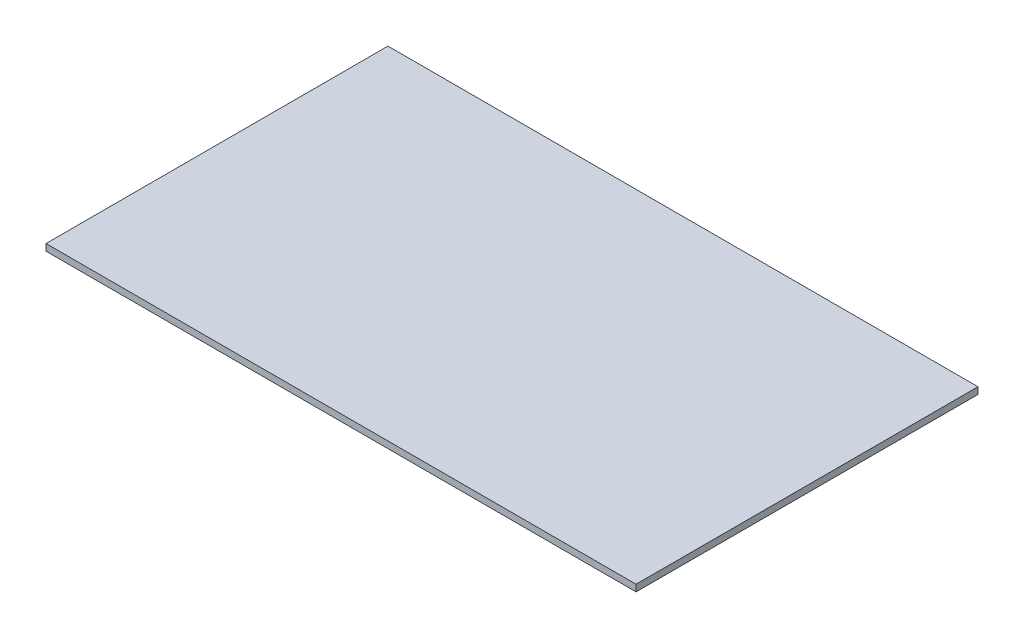
ISO-10303-21;
HEADER;
FILE_DESCRIPTION(('STEP AP214'),'2;1');
FILE_NAME('part.step','',(''),(''),'','','');
FILE_SCHEMA(('AUTOMOTIVE_DESIGN { 1 0 10303 214 1 1 1 1 }'));
ENDSEC;
DATA;
#1=APPLICATION_CONTEXT('core data for automotive mechanical design processes');
#2=APPLICATION_PROTOCOL_DEFINITION('international standard','automotive_design',2000,#1);
#3=PRODUCT_CONTEXT('',#1,'mechanical');
#4=PRODUCT('Part','Part','',(#3));
#5=PRODUCT_RELATED_PRODUCT_CATEGORY('part','',(#4));
#6=PRODUCT_DEFINITION_FORMATION('','',#4);
#7=PRODUCT_DEFINITION_CONTEXT('part definition',#1,'design');
#8=PRODUCT_DEFINITION('design','',#6,#7);
#9=PRODUCT_DEFINITION_SHAPE('','',#8);
#10=(LENGTH_UNIT() NAMED_UNIT(*) SI_UNIT(.MILLI.,.METRE.));
#11=(NAMED_UNIT(*) PLANE_ANGLE_UNIT() SI_UNIT($,.RADIAN.));
#12=(NAMED_UNIT(*) SI_UNIT($,.STERADIAN.) SOLID_ANGLE_UNIT());
#13=UNCERTAINTY_MEASURE_WITH_UNIT(LENGTH_MEASURE(1.E-05),#10,'distance_accuracy_value','');
#14=(GEOMETRIC_REPRESENTATION_CONTEXT(3) GLOBAL_UNCERTAINTY_ASSIGNED_CONTEXT((#13)) GLOBAL_UNIT_ASSIGNED_CONTEXT((#10,
#11,#12)) REPRESENTATION_CONTEXT('',''));
#15=CARTESIAN_POINT('',(0.,0.,0.));
#16=DIRECTION('',(0.,0.,1.));
#17=DIRECTION('',(1.,0.,0.));
#18=AXIS2_PLACEMENT_3D('',#15,#16,#17);
#19=CARTESIAN_POINT('',(141.5,3.2,-82.));
#20=DIRECTION('',(-1.,0.,0.));
#21=DIRECTION('',(0.,0.,1.));
#22=AXIS2_PLACEMENT_3D('',#19,#20,#21);
#23=PLANE('',#22);
#24=DIRECTION('',(0.,0.,-1.));
#25=VECTOR('',#24,1.);
#26=CARTESIAN_POINT('',(141.5,0.,-82.));
#27=LINE('',#26,#25);
#28=CARTESIAN_POINT('',(141.5,0.,82.));
#29=VERTEX_POINT('',#28);
#30=CARTESIAN_POINT('',(141.5,0.,-82.));
#31=VERTEX_POINT('',#30);
#32=EDGE_CURVE('E102',#29,#31,#27,.T.);
#33=ORIENTED_EDGE('',*,*,#32,.T.);
#34=DIRECTION('',(0.,-1.,0.));
#35=VECTOR('',#34,1.);
#36=CARTESIAN_POINT('',(141.5,3.2,-82.));
#37=LINE('',#36,#35);
#38=CARTESIAN_POINT('',(141.5,3.2,-82.));
#39=VERTEX_POINT('',#38);
#40=EDGE_CURVE('E11',#39,#31,#37,.T.);
#41=ORIENTED_EDGE('',*,*,#40,.F.);
#42=DIRECTION('',(0.,0.,-1.));
#43=VECTOR('',#42,1.);
#44=CARTESIAN_POINT('',(141.5,3.2,-82.));
#45=LINE('',#44,#43);
#46=CARTESIAN_POINT('',(141.5,3.2,82.));
#47=VERTEX_POINT('',#46);
#48=EDGE_CURVE('E90',#47,#39,#45,.T.);
#49=ORIENTED_EDGE('',*,*,#48,.F.);
#50=DIRECTION('',(0.,-1.,0.));
#51=VECTOR('',#50,1.);
#52=CARTESIAN_POINT('',(141.5,3.2,82.));
#53=LINE('',#52,#51);
#54=EDGE_CURVE('E98',#47,#29,#53,.T.);
#55=ORIENTED_EDGE('',*,*,#54,.T.);
#56=EDGE_LOOP('',(#33,#41,#49,#55));
#57=FACE_BOUND('',#56,.T.);
#58=ADVANCED_FACE('F39',(#57),#23,.F.);
#59=CARTESIAN_POINT('',(-141.5,3.2,-82.));
#60=DIRECTION('',(0.,0.,1.));
#61=DIRECTION('',(1.,0.,0.));
#62=AXIS2_PLACEMENT_3D('',#59,#60,#61);
#63=PLANE('',#62);
#64=DIRECTION('',(-1.,0.,0.));
#65=VECTOR('',#64,1.);
#66=CARTESIAN_POINT('',(-141.5,0.,-82.));
#67=LINE('',#66,#65);
#68=CARTESIAN_POINT('',(-141.5,0.,-82.));
#69=VERTEX_POINT('',#68);
#70=EDGE_CURVE('E94',#31,#69,#67,.T.);
#71=ORIENTED_EDGE('',*,*,#70,.T.);
#72=DIRECTION('',(0.,-1.,0.));
#73=VECTOR('',#72,1.);
#74=CARTESIAN_POINT('',(-141.5,3.2,-82.));
#75=LINE('',#74,#73);
#76=CARTESIAN_POINT('',(-141.5,3.2,-82.));
#77=VERTEX_POINT('',#76);
#78=EDGE_CURVE('E47',#77,#69,#75,.T.);
#79=ORIENTED_EDGE('',*,*,#78,.F.);
#80=DIRECTION('',(-1.,0.,0.));
#81=VECTOR('',#80,1.);
#82=CARTESIAN_POINT('',(-141.5,3.2,-82.));
#83=LINE('',#82,#81);
#84=EDGE_CURVE('E85',#39,#77,#83,.T.);
#85=ORIENTED_EDGE('',*,*,#84,.F.);
#86=ORIENTED_EDGE('',*,*,#40,.T.);
#87=EDGE_LOOP('',(#71,#79,#85,#86));
#88=FACE_BOUND('',#87,.T.);
#89=ADVANCED_FACE('F93',(#88),#63,.F.);
#90=CARTESIAN_POINT('',(-141.5,3.2,-82.));
#91=DIRECTION('',(1.,0.,0.));
#92=DIRECTION('',(0.,0.,-1.));
#93=AXIS2_PLACEMENT_3D('',#90,#91,#92);
#94=PLANE('',#93);
#95=DIRECTION('',(0.,0.,1.));
#96=VECTOR('',#95,1.);
#97=CARTESIAN_POINT('',(-141.5,0.,-82.));
#98=LINE('',#97,#96);
#99=CARTESIAN_POINT('',(-141.5,0.,82.));
#100=VERTEX_POINT('',#99);
#101=EDGE_CURVE('E72',#69,#100,#98,.T.);
#102=ORIENTED_EDGE('',*,*,#101,.T.);
#103=DIRECTION('',(0.,-1.,0.));
#104=VECTOR('',#103,1.);
#105=CARTESIAN_POINT('',(-141.5,3.2,82.));
#106=LINE('',#105,#104);
#107=CARTESIAN_POINT('',(-141.5,3.2,82.));
#108=VERTEX_POINT('',#107);
#109=EDGE_CURVE('E95',#108,#100,#106,.T.);
#110=ORIENTED_EDGE('',*,*,#109,.F.);
#111=DIRECTION('',(0.,0.,1.));
#112=VECTOR('',#111,1.);
#113=CARTESIAN_POINT('',(-141.5,3.2,-82.));
#114=LINE('',#113,#112);
#115=EDGE_CURVE('E88',#77,#108,#114,.T.);
#116=ORIENTED_EDGE('',*,*,#115,.F.);
#117=ORIENTED_EDGE('',*,*,#78,.T.);
#118=EDGE_LOOP('',(#102,#110,#116,#117));
#119=FACE_BOUND('',#118,.T.);
#120=ADVANCED_FACE('F96',(#119),#94,.F.);
#121=CARTESIAN_POINT('',(-141.5,3.2,82.));
#122=DIRECTION('',(0.,0.,-1.));
#123=DIRECTION('',(-1.,0.,0.));
#124=AXIS2_PLACEMENT_3D('',#121,#122,#123);
#125=PLANE('',#124);
#126=DIRECTION('',(1.,0.,0.));
#127=VECTOR('',#126,1.);
#128=CARTESIAN_POINT('',(-141.5,0.,82.));
#129=LINE('',#128,#127);
#130=EDGE_CURVE('E78',#100,#29,#129,.T.);
#131=ORIENTED_EDGE('',*,*,#130,.T.);
#132=ORIENTED_EDGE('',*,*,#54,.F.);
#133=DIRECTION('',(1.,0.,0.));
#134=VECTOR('',#133,1.);
#135=CARTESIAN_POINT('',(-141.5,3.2,82.));
#136=LINE('',#135,#134);
#137=EDGE_CURVE('E55',#108,#47,#136,.T.);
#138=ORIENTED_EDGE('',*,*,#137,.F.);
#139=ORIENTED_EDGE('',*,*,#109,.T.);
#140=EDGE_LOOP('',(#131,#132,#138,#139));
#141=FACE_BOUND('',#140,.T.);
#142=ADVANCED_FACE('F109',(#141),#125,.F.);
#143=CARTESIAN_POINT('',(0.,3.2,0.));
#144=DIRECTION('',(0.,1.,0.));
#145=DIRECTION('',(0.,0.,1.));
#146=AXIS2_PLACEMENT_3D('',#143,#144,#145);
#147=PLANE('',#146);
#148=ORIENTED_EDGE('',*,*,#48,.T.);
#149=ORIENTED_EDGE('',*,*,#84,.T.);
#150=ORIENTED_EDGE('',*,*,#115,.T.);
#151=ORIENTED_EDGE('',*,*,#137,.T.);
#152=EDGE_LOOP('',(#148,#149,#150,#151));
#153=FACE_BOUND('',#152,.T.);
#154=ADVANCED_FACE('F86',(#153),#147,.T.);
#155=CARTESIAN_POINT('',(0.,0.,0.));
#156=DIRECTION('',(0.,1.,0.));
#157=DIRECTION('',(0.,0.,1.));
#158=AXIS2_PLACEMENT_3D('',#155,#156,#157);
#159=PLANE('',#158);
#160=ORIENTED_EDGE('',*,*,#32,.F.);
#161=ORIENTED_EDGE('',*,*,#130,.F.);
#162=ORIENTED_EDGE('',*,*,#101,.F.);
#163=ORIENTED_EDGE('',*,*,#70,.F.);
#164=EDGE_LOOP('',(#160,#161,#162,#163));
#165=FACE_BOUND('',#164,.T.);
#166=ADVANCED_FACE('F112',(#165),#159,.F.);
#167=CLOSED_SHELL('',(#58,#89,#120,#142,#154,#166));
#168=MANIFOLD_SOLID_BREP('B2',#167);
#169=ADVANCED_BREP_SHAPE_REPRESENTATION('',(#18,#168),#14);
#170=SHAPE_DEFINITION_REPRESENTATION(#9,#169);
ENDSEC;
END-ISO-10303-21;
